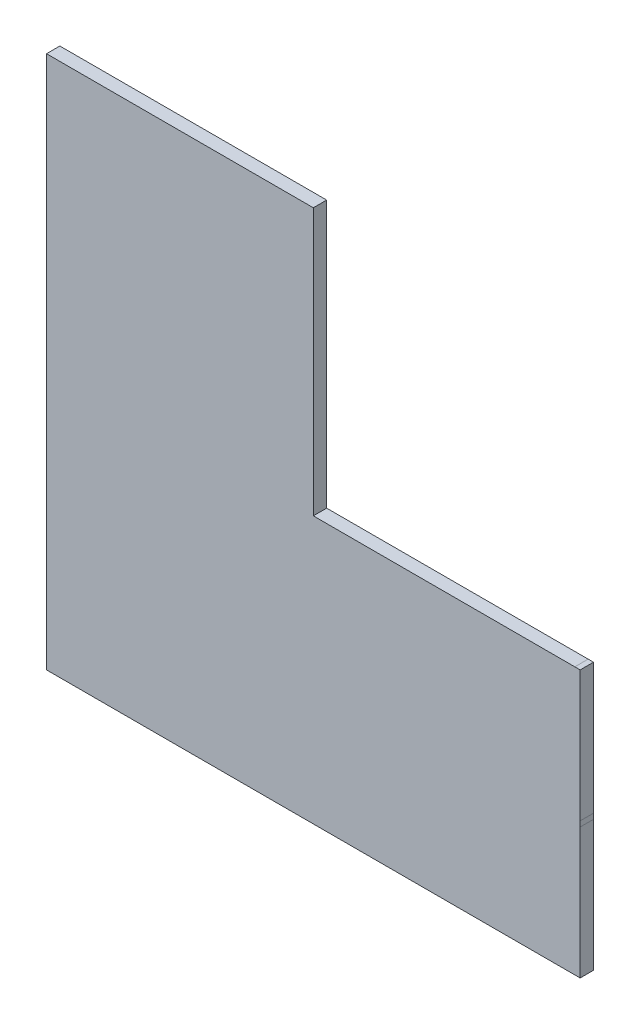
ISO-10303-21;
HEADER;
FILE_DESCRIPTION(('STEP AP214'),'2;1');
FILE_NAME('part.step','',(''),(''),'','','');
FILE_SCHEMA(('AUTOMOTIVE_DESIGN { 1 0 10303 214 1 1 1 1 }'));
ENDSEC;
DATA;
#1=APPLICATION_CONTEXT('core data for automotive mechanical design processes');
#2=APPLICATION_PROTOCOL_DEFINITION('international standard','automotive_design',2000,#1);
#3=PRODUCT_CONTEXT('',#1,'mechanical');
#4=PRODUCT('Part','Part','',(#3));
#5=PRODUCT_RELATED_PRODUCT_CATEGORY('part','',(#4));
#6=PRODUCT_DEFINITION_FORMATION('','',#4);
#7=PRODUCT_DEFINITION_CONTEXT('part definition',#1,'design');
#8=PRODUCT_DEFINITION('design','',#6,#7);
#9=PRODUCT_DEFINITION_SHAPE('','',#8);
#10=(LENGTH_UNIT() NAMED_UNIT(*) SI_UNIT(.MILLI.,.METRE.));
#11=(NAMED_UNIT(*) PLANE_ANGLE_UNIT() SI_UNIT($,.RADIAN.));
#12=(NAMED_UNIT(*) SI_UNIT($,.STERADIAN.) SOLID_ANGLE_UNIT());
#13=UNCERTAINTY_MEASURE_WITH_UNIT(LENGTH_MEASURE(1.E-05),#10,'distance_accuracy_value','');
#14=(GEOMETRIC_REPRESENTATION_CONTEXT(3) GLOBAL_UNCERTAINTY_ASSIGNED_CONTEXT((#13)) GLOBAL_UNIT_ASSIGNED_CONTEXT((#10,
#11,#12)) REPRESENTATION_CONTEXT('',''));
#15=CARTESIAN_POINT('',(0.,0.,0.));
#16=DIRECTION('',(0.,0.,1.));
#17=DIRECTION('',(1.,0.,0.));
#18=AXIS2_PLACEMENT_3D('',#15,#16,#17);
#19=CARTESIAN_POINT('',(1000.,500.,25.));
#20=DIRECTION('',(0.,-1.,0.));
#21=DIRECTION('',(1.,0.,0.));
#22=AXIS2_PLACEMENT_3D('',#19,#20,#21);
#23=PLANE('',#22);
#24=DIRECTION('',(0.,0.,1.));
#25=VECTOR('',#24,1.);
#26=CARTESIAN_POINT('',(990.,500.,25.));
#27=LINE('',#26,#25);
#28=CARTESIAN_POINT('',(990.,500.,0.));
#29=VERTEX_POINT('',#28);
#30=CARTESIAN_POINT('',(990.,500.,25.));
#31=VERTEX_POINT('',#30);
#32=EDGE_CURVE('E11',#29,#31,#27,.T.);
#33=ORIENTED_EDGE('',*,*,#32,.F.);
#34=DIRECTION('',(-1.,0.,0.));
#35=VECTOR('',#34,1.);
#36=CARTESIAN_POINT('',(1000.,500.,0.));
#37=LINE('',#36,#35);
#38=CARTESIAN_POINT('',(500.,500.,0.));
#39=VERTEX_POINT('',#38);
#40=EDGE_CURVE('E175',#29,#39,#37,.T.);
#41=ORIENTED_EDGE('',*,*,#40,.T.);
#42=DIRECTION('',(0.,0.,-1.));
#43=VECTOR('',#42,1.);
#44=CARTESIAN_POINT('',(500.,500.,25.));
#45=LINE('',#44,#43);
#46=CARTESIAN_POINT('',(500.,500.,25.));
#47=VERTEX_POINT('',#46);
#48=EDGE_CURVE('E208',#47,#39,#45,.T.);
#49=ORIENTED_EDGE('',*,*,#48,.F.);
#50=DIRECTION('',(-1.,0.,0.));
#51=VECTOR('',#50,1.);
#52=CARTESIAN_POINT('',(1000.,500.,25.));
#53=LINE('',#52,#51);
#54=EDGE_CURVE('E199',#31,#47,#53,.T.);
#55=ORIENTED_EDGE('',*,*,#54,.F.);
#56=EDGE_LOOP('',(#33,#41,#49,#55));
#57=FACE_BOUND('',#56,.T.);
#58=ADVANCED_FACE('F47',(#57),#23,.F.);
#59=CARTESIAN_POINT('',(1000.,0.,25.));
#60=DIRECTION('',(-1.,0.,0.));
#61=DIRECTION('',(0.,-1.,0.));
#62=AXIS2_PLACEMENT_3D('',#59,#60,#61);
#63=PLANE('',#62);
#64=DIRECTION('',(0.,0.,-1.));
#65=VECTOR('',#64,1.);
#66=CARTESIAN_POINT('',(1000.,245.,25.));
#67=LINE('',#66,#65);
#68=CARTESIAN_POINT('',(1000.,245.,25.));
#69=VERTEX_POINT('',#68);
#70=CARTESIAN_POINT('',(1000.,245.,0.));
#71=VERTEX_POINT('',#70);
#72=EDGE_CURVE('E56',#69,#71,#67,.T.);
#73=ORIENTED_EDGE('',*,*,#72,.F.);
#74=DIRECTION('',(0.,1.,0.));
#75=VECTOR('',#74,1.);
#76=CARTESIAN_POINT('',(1000.,0.,25.));
#77=LINE('',#76,#75);
#78=CARTESIAN_POINT('',(1000.,0.,25.));
#79=VERTEX_POINT('',#78);
#80=EDGE_CURVE('E200',#79,#69,#77,.T.);
#81=ORIENTED_EDGE('',*,*,#80,.F.);
#82=DIRECTION('',(0.,0.,-1.));
#83=VECTOR('',#82,1.);
#84=CARTESIAN_POINT('',(1000.,0.,25.));
#85=LINE('',#84,#83);
#86=CARTESIAN_POINT('',(1000.,0.,0.));
#87=VERTEX_POINT('',#86);
#88=EDGE_CURVE('E123',#79,#87,#85,.T.);
#89=ORIENTED_EDGE('',*,*,#88,.T.);
#90=DIRECTION('',(0.,1.,0.));
#91=VECTOR('',#90,1.);
#92=CARTESIAN_POINT('',(1000.,0.,0.));
#93=LINE('',#92,#91);
#94=EDGE_CURVE('E168',#87,#71,#93,.T.);
#95=ORIENTED_EDGE('',*,*,#94,.T.);
#96=EDGE_LOOP('',(#73,#81,#89,#95));
#97=FACE_BOUND('',#96,.T.);
#98=ADVANCED_FACE('F173',(#97),#63,.F.);
#99=CARTESIAN_POINT('',(1000.,255.,25.));
#100=VERTEX_POINT('',#99);
#101=EDGE_CURVE('E161',#69,#100,#77,.T.);
#102=ORIENTED_EDGE('',*,*,#101,.F.);
#103=ORIENTED_EDGE('',*,*,#72,.T.);
#104=CARTESIAN_POINT('',(1000.,255.,0.));
#105=VERTEX_POINT('',#104);
#106=EDGE_CURVE('E160',#71,#105,#93,.T.);
#107=ORIENTED_EDGE('',*,*,#106,.T.);
#108=DIRECTION('',(0.,0.,-1.));
#109=VECTOR('',#108,1.);
#110=CARTESIAN_POINT('',(1000.,255.,25.));
#111=LINE('',#110,#109);
#112=EDGE_CURVE('E144',#100,#105,#111,.T.);
#113=ORIENTED_EDGE('',*,*,#112,.F.);
#114=EDGE_LOOP('',(#102,#103,#107,#113));
#115=FACE_BOUND('',#114,.T.);
#116=ADVANCED_FACE('F158',(#115),#63,.F.);
#117=CARTESIAN_POINT('',(0.,1000.,25.));
#118=DIRECTION('',(1.,0.,0.));
#119=DIRECTION('',(0.,1.,0.));
#120=AXIS2_PLACEMENT_3D('',#117,#118,#119);
#121=PLANE('',#120);
#122=DIRECTION('',(0.,-1.,0.));
#123=VECTOR('',#122,1.);
#124=CARTESIAN_POINT('',(0.,1000.,0.));
#125=LINE('',#124,#123);
#126=CARTESIAN_POINT('',(0.,1000.,0.));
#127=VERTEX_POINT('',#126);
#128=CARTESIAN_POINT('',(0.,0.,0.));
#129=VERTEX_POINT('',#128);
#130=EDGE_CURVE('E142',#127,#129,#125,.T.);
#131=ORIENTED_EDGE('',*,*,#130,.T.);
#132=DIRECTION('',(0.,0.,-1.));
#133=VECTOR('',#132,1.);
#134=CARTESIAN_POINT('',(0.,0.,25.));
#135=LINE('',#134,#133);
#136=CARTESIAN_POINT('',(0.,0.,25.));
#137=VERTEX_POINT('',#136);
#138=EDGE_CURVE('E120',#137,#129,#135,.T.);
#139=ORIENTED_EDGE('',*,*,#138,.F.);
#140=DIRECTION('',(0.,-1.,0.));
#141=VECTOR('',#140,1.);
#142=CARTESIAN_POINT('',(0.,1000.,25.));
#143=LINE('',#142,#141);
#144=CARTESIAN_POINT('',(0.,1000.,25.));
#145=VERTEX_POINT('',#144);
#146=EDGE_CURVE('E129',#145,#137,#143,.T.);
#147=ORIENTED_EDGE('',*,*,#146,.F.);
#148=DIRECTION('',(0.,0.,-1.));
#149=VECTOR('',#148,1.);
#150=CARTESIAN_POINT('',(0.,1000.,25.));
#151=LINE('',#150,#149);
#152=EDGE_CURVE('E191',#145,#127,#151,.T.);
#153=ORIENTED_EDGE('',*,*,#152,.T.);
#154=EDGE_LOOP('',(#131,#139,#147,#153));
#155=FACE_BOUND('',#154,.T.);
#156=ADVANCED_FACE('F49',(#155),#121,.F.);
#157=CARTESIAN_POINT('',(0.,0.,25.));
#158=DIRECTION('',(0.,1.,0.));
#159=DIRECTION('',(0.,0.,1.));
#160=AXIS2_PLACEMENT_3D('',#157,#158,#159);
#161=PLANE('',#160);
#162=DIRECTION('',(1.,0.,0.));
#163=VECTOR('',#162,1.);
#164=CARTESIAN_POINT('',(0.,0.,0.));
#165=LINE('',#164,#163);
#166=EDGE_CURVE('E181',#129,#87,#165,.T.);
#167=ORIENTED_EDGE('',*,*,#166,.T.);
#168=ORIENTED_EDGE('',*,*,#88,.F.);
#169=DIRECTION('',(1.,0.,0.));
#170=VECTOR('',#169,1.);
#171=CARTESIAN_POINT('',(0.,0.,25.));
#172=LINE('',#171,#170);
#173=EDGE_CURVE('E116',#137,#79,#172,.T.);
#174=ORIENTED_EDGE('',*,*,#173,.F.);
#175=ORIENTED_EDGE('',*,*,#138,.T.);
#176=EDGE_LOOP('',(#167,#168,#174,#175));
#177=FACE_BOUND('',#176,.T.);
#178=ADVANCED_FACE('F118',(#177),#161,.F.);
#179=CARTESIAN_POINT('',(1000.,500.,25.));
#180=VERTEX_POINT('',#179);
#181=EDGE_CURVE('E128',#100,#180,#77,.T.);
#182=ORIENTED_EDGE('',*,*,#181,.F.);
#183=ORIENTED_EDGE('',*,*,#112,.T.);
#184=CARTESIAN_POINT('',(1000.,500.,0.));
#185=VERTEX_POINT('',#184);
#186=EDGE_CURVE('E170',#105,#185,#93,.T.);
#187=ORIENTED_EDGE('',*,*,#186,.T.);
#188=DIRECTION('',(0.,0.,-1.));
#189=VECTOR('',#188,1.);
#190=CARTESIAN_POINT('',(1000.,500.,25.));
#191=LINE('',#190,#189);
#192=EDGE_CURVE('E150',#180,#185,#191,.T.);
#193=ORIENTED_EDGE('',*,*,#192,.F.);
#194=EDGE_LOOP('',(#182,#183,#187,#193));
#195=FACE_BOUND('',#194,.T.);
#196=ADVANCED_FACE('F206',(#195),#63,.F.);
#197=EDGE_CURVE('E177',#185,#29,#37,.T.);
#198=ORIENTED_EDGE('',*,*,#197,.T.);
#199=ORIENTED_EDGE('',*,*,#32,.T.);
#200=EDGE_CURVE('E195',#180,#31,#53,.T.);
#201=ORIENTED_EDGE('',*,*,#200,.F.);
#202=ORIENTED_EDGE('',*,*,#192,.T.);
#203=EDGE_LOOP('',(#198,#199,#201,#202));
#204=FACE_BOUND('',#203,.T.);
#205=ADVANCED_FACE('F209',(#204),#23,.F.);
#206=CARTESIAN_POINT('',(500.,500.,25.));
#207=DIRECTION('',(-1.,0.,0.));
#208=DIRECTION('',(0.,0.,1.));
#209=AXIS2_PLACEMENT_3D('',#206,#207,#208);
#210=PLANE('',#209);
#211=DIRECTION('',(0.,1.,0.));
#212=VECTOR('',#211,1.);
#213=CARTESIAN_POINT('',(500.,500.,0.));
#214=LINE('',#213,#212);
#215=CARTESIAN_POINT('',(500.,1000.,0.));
#216=VERTEX_POINT('',#215);
#217=EDGE_CURVE('E318',#39,#216,#214,.T.);
#218=ORIENTED_EDGE('',*,*,#217,.T.);
#219=DIRECTION('',(0.,0.,-1.));
#220=VECTOR('',#219,1.);
#221=CARTESIAN_POINT('',(500.,1000.,25.));
#222=LINE('',#221,#220);
#223=CARTESIAN_POINT('',(500.,1000.,25.));
#224=VERTEX_POINT('',#223);
#225=EDGE_CURVE('E315',#224,#216,#222,.T.);
#226=ORIENTED_EDGE('',*,*,#225,.F.);
#227=DIRECTION('',(0.,1.,0.));
#228=VECTOR('',#227,1.);
#229=CARTESIAN_POINT('',(500.,500.,25.));
#230=LINE('',#229,#228);
#231=EDGE_CURVE('E192',#47,#224,#230,.T.);
#232=ORIENTED_EDGE('',*,*,#231,.F.);
#233=ORIENTED_EDGE('',*,*,#48,.T.);
#234=EDGE_LOOP('',(#218,#226,#232,#233));
#235=FACE_BOUND('',#234,.T.);
#236=ADVANCED_FACE('F211',(#235),#210,.F.);
#237=CARTESIAN_POINT('',(500.,1000.,25.));
#238=DIRECTION('',(0.,-1.,0.));
#239=DIRECTION('',(1.,0.,0.));
#240=AXIS2_PLACEMENT_3D('',#237,#238,#239);
#241=PLANE('',#240);
#242=DIRECTION('',(-1.,0.,0.));
#243=VECTOR('',#242,1.);
#244=CARTESIAN_POINT('',(500.,1000.,0.));
#245=LINE('',#244,#243);
#246=EDGE_CURVE('E139',#216,#127,#245,.T.);
#247=ORIENTED_EDGE('',*,*,#246,.T.);
#248=ORIENTED_EDGE('',*,*,#152,.F.);
#249=DIRECTION('',(-1.,0.,0.));
#250=VECTOR('',#249,1.);
#251=CARTESIAN_POINT('',(500.,1000.,25.));
#252=LINE('',#251,#250);
#253=EDGE_CURVE('E134',#224,#145,#252,.T.);
#254=ORIENTED_EDGE('',*,*,#253,.F.);
#255=ORIENTED_EDGE('',*,*,#225,.T.);
#256=EDGE_LOOP('',(#247,#248,#254,#255));
#257=FACE_BOUND('',#256,.T.);
#258=ADVANCED_FACE('F218',(#257),#241,.F.);
#259=CARTESIAN_POINT('',(0.,0.,25.));
#260=DIRECTION('',(0.,0.,1.));
#261=DIRECTION('',(1.,0.,0.));
#262=AXIS2_PLACEMENT_3D('',#259,#260,#261);
#263=PLANE('',#262);
#264=ORIENTED_EDGE('',*,*,#146,.T.);
#265=ORIENTED_EDGE('',*,*,#173,.T.);
#266=ORIENTED_EDGE('',*,*,#80,.T.);
#267=ORIENTED_EDGE('',*,*,#101,.T.);
#268=ORIENTED_EDGE('',*,*,#181,.T.);
#269=ORIENTED_EDGE('',*,*,#200,.T.);
#270=ORIENTED_EDGE('',*,*,#54,.T.);
#271=ORIENTED_EDGE('',*,*,#231,.T.);
#272=ORIENTED_EDGE('',*,*,#253,.T.);
#273=EDGE_LOOP('',(#264,#265,#266,#267,#268,#269,#270,#271,#272));
#274=FACE_BOUND('',#273,.T.);
#275=ADVANCED_FACE('F132',(#274),#263,.T.);
#276=CARTESIAN_POINT('',(0.,0.,0.));
#277=DIRECTION('',(0.,0.,1.));
#278=DIRECTION('',(1.,0.,0.));
#279=AXIS2_PLACEMENT_3D('',#276,#277,#278);
#280=PLANE('',#279);
#281=ORIENTED_EDGE('',*,*,#130,.F.);
#282=ORIENTED_EDGE('',*,*,#246,.F.);
#283=ORIENTED_EDGE('',*,*,#217,.F.);
#284=ORIENTED_EDGE('',*,*,#40,.F.);
#285=ORIENTED_EDGE('',*,*,#197,.F.);
#286=ORIENTED_EDGE('',*,*,#186,.F.);
#287=ORIENTED_EDGE('',*,*,#106,.F.);
#288=ORIENTED_EDGE('',*,*,#94,.F.);
#289=ORIENTED_EDGE('',*,*,#166,.F.);
#290=EDGE_LOOP('',(#281,#282,#283,#284,#285,#286,#287,#288,#289));
#291=FACE_BOUND('',#290,.T.);
#292=ADVANCED_FACE('F167',(#291),#280,.F.);
#293=CLOSED_SHELL('',(#58,#98,#116,#156,#178,#196,#205,#236,#258,#275,#292));
#294=MANIFOLD_SOLID_BREP('B2',#293);
#295=ADVANCED_BREP_SHAPE_REPRESENTATION('',(#18,#294),#14);
#296=SHAPE_DEFINITION_REPRESENTATION(#9,#295);
ENDSEC;
END-ISO-10303-21;
